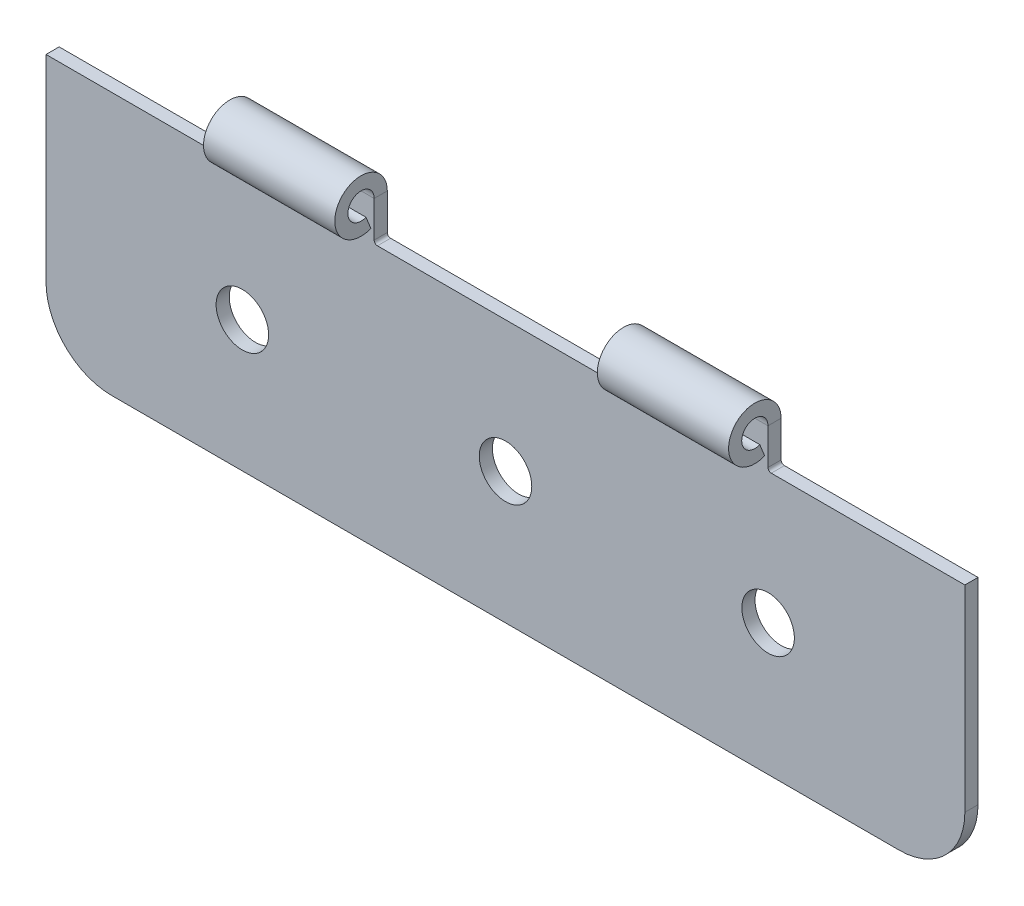
ISO-10303-21;
HEADER;
FILE_DESCRIPTION(('STEP AP214'),'2;1');
FILE_NAME('part.step','',(''),(''),'','','');
FILE_SCHEMA(('AUTOMOTIVE_DESIGN { 1 0 10303 214 1 1 1 1 }'));
ENDSEC;
DATA;
#1=APPLICATION_CONTEXT('core data for automotive mechanical design processes');
#2=APPLICATION_PROTOCOL_DEFINITION('international standard','automotive_design',2000,#1);
#3=PRODUCT_CONTEXT('',#1,'mechanical');
#4=PRODUCT('Part','Part','',(#3));
#5=PRODUCT_RELATED_PRODUCT_CATEGORY('part','',(#4));
#6=PRODUCT_DEFINITION_FORMATION('','',#4);
#7=PRODUCT_DEFINITION_CONTEXT('part definition',#1,'design');
#8=PRODUCT_DEFINITION('design','',#6,#7);
#9=PRODUCT_DEFINITION_SHAPE('','',#8);
#10=(LENGTH_UNIT() NAMED_UNIT(*) SI_UNIT(.MILLI.,.METRE.));
#11=(NAMED_UNIT(*) PLANE_ANGLE_UNIT() SI_UNIT($,.RADIAN.));
#12=(NAMED_UNIT(*) SI_UNIT($,.STERADIAN.) SOLID_ANGLE_UNIT());
#13=UNCERTAINTY_MEASURE_WITH_UNIT(LENGTH_MEASURE(1.E-05),#10,'distance_accuracy_value','');
#14=(GEOMETRIC_REPRESENTATION_CONTEXT(3) GLOBAL_UNCERTAINTY_ASSIGNED_CONTEXT((#13)) GLOBAL_UNIT_ASSIGNED_CONTEXT((#10,
#11,#12)) REPRESENTATION_CONTEXT('',''));
#15=CARTESIAN_POINT('',(0.,0.,0.));
#16=DIRECTION('',(0.,0.,1.));
#17=DIRECTION('',(1.,0.,0.));
#18=AXIS2_PLACEMENT_3D('',#15,#16,#17);
#19=CARTESIAN_POINT('',(45.,20.,-1.));
#20=DIRECTION('',(-1.,0.,0.));
#21=DIRECTION('',(0.,0.,1.));
#22=AXIS2_PLACEMENT_3D('',#19,#20,#21);
#23=PLANE('',#22);
#24=DIRECTION('',(0.,-1.,0.));
#25=VECTOR('',#24,1.);
#26=CARTESIAN_POINT('',(45.,20.,-1.));
#27=LINE('',#26,#25);
#28=CARTESIAN_POINT('',(45.,23.,-1.));
#29=VERTEX_POINT('',#28);
#30=CARTESIAN_POINT('',(45.,20.25,-1.));
#31=VERTEX_POINT('',#30);
#32=EDGE_CURVE('E198',#29,#31,#27,.T.);
#33=ORIENTED_EDGE('',*,*,#32,.T.);
#34=DIRECTION('',(0.,0.,1.));
#35=VECTOR('',#34,1.);
#36=CARTESIAN_POINT('',(45.,20.25,0.));
#37=LINE('',#36,#35);
#38=CARTESIAN_POINT('',(45.,20.25,0.));
#39=VERTEX_POINT('',#38);
#40=EDGE_CURVE('E356',#31,#39,#37,.T.);
#41=ORIENTED_EDGE('',*,*,#40,.T.);
#42=DIRECTION('',(0.,-1.,0.));
#43=VECTOR('',#42,1.);
#44=CARTESIAN_POINT('',(45.,20.,0.));
#45=LINE('',#44,#43);
#46=CARTESIAN_POINT('',(45.,23.,0.));
#47=VERTEX_POINT('',#46);
#48=EDGE_CURVE('E314',#47,#39,#45,.T.);
#49=ORIENTED_EDGE('',*,*,#48,.F.);
#50=DIRECTION('',(0.,0.,-1.));
#51=VECTOR('',#50,1.);
#52=CARTESIAN_POINT('',(45.,23.,0.));
#53=LINE('',#52,#51);
#54=EDGE_CURVE('E210',#47,#29,#53,.T.);
#55=ORIENTED_EDGE('',*,*,#54,.T.);
#56=EDGE_LOOP('',(#33,#41,#49,#55));
#57=FACE_BOUND('',#56,.T.);
#58=ADVANCED_FACE('F41',(#57),#23,.T.);
#59=CARTESIAN_POINT('',(15.,20.,-1.));
#60=DIRECTION('',(-1.,0.,0.));
#61=DIRECTION('',(0.,0.,1.));
#62=AXIS2_PLACEMENT_3D('',#59,#60,#61);
#63=PLANE('',#62);
#64=DIRECTION('',(0.,-1.,0.));
#65=VECTOR('',#64,1.);
#66=CARTESIAN_POINT('',(15.,20.,-1.));
#67=LINE('',#66,#65);
#68=CARTESIAN_POINT('',(15.,23.,-1.));
#69=VERTEX_POINT('',#68);
#70=CARTESIAN_POINT('',(15.,20.25,-1.));
#71=VERTEX_POINT('',#70);
#72=EDGE_CURVE('E296',#69,#71,#67,.T.);
#73=ORIENTED_EDGE('',*,*,#72,.T.);
#74=DIRECTION('',(0.,0.,1.));
#75=VECTOR('',#74,1.);
#76=CARTESIAN_POINT('',(15.,20.25,0.));
#77=LINE('',#76,#75);
#78=CARTESIAN_POINT('',(15.,20.25,0.));
#79=VERTEX_POINT('',#78);
#80=EDGE_CURVE('E351',#71,#79,#77,.T.);
#81=ORIENTED_EDGE('',*,*,#80,.T.);
#82=DIRECTION('',(0.,-1.,0.));
#83=VECTOR('',#82,1.);
#84=CARTESIAN_POINT('',(15.,20.,0.));
#85=LINE('',#84,#83);
#86=CARTESIAN_POINT('',(15.,23.,0.));
#87=VERTEX_POINT('',#86);
#88=EDGE_CURVE('E321',#87,#79,#85,.T.);
#89=ORIENTED_EDGE('',*,*,#88,.F.);
#90=DIRECTION('',(0.,0.,-1.));
#91=VECTOR('',#90,1.);
#92=CARTESIAN_POINT('',(15.,23.,0.));
#93=LINE('',#92,#91);
#94=EDGE_CURVE('E256',#87,#69,#93,.T.);
#95=ORIENTED_EDGE('',*,*,#94,.T.);
#96=EDGE_LOOP('',(#73,#81,#89,#95));
#97=FACE_BOUND('',#96,.T.);
#98=ADVANCED_FACE('F422',(#97),#63,.T.);
#99=CARTESIAN_POINT('',(70.,0.,-1.));
#100=DIRECTION('',(0.,-1.,0.));
#101=DIRECTION('',(1.,0.,0.));
#102=AXIS2_PLACEMENT_3D('',#99,#100,#101);
#103=PLANE('',#102);
#104=DIRECTION('',(1.,0.,0.));
#105=VECTOR('',#104,1.);
#106=CARTESIAN_POINT('',(70.,0.,0.));
#107=LINE('',#106,#105);
#108=CARTESIAN_POINT('',(5.,0.,0.));
#109=VERTEX_POINT('',#108);
#110=CARTESIAN_POINT('',(65.,0.,0.));
#111=VERTEX_POINT('',#110);
#112=EDGE_CURVE('E279',#109,#111,#107,.T.);
#113=ORIENTED_EDGE('',*,*,#112,.F.);
#114=DIRECTION('',(0.,0.,1.));
#115=VECTOR('',#114,1.);
#116=CARTESIAN_POINT('',(5.,0.,-1.));
#117=LINE('',#116,#115);
#118=CARTESIAN_POINT('',(5.,0.,-1.));
#119=VERTEX_POINT('',#118);
#120=EDGE_CURVE('E343',#109,#119,#117,.F.);
#121=ORIENTED_EDGE('',*,*,#120,.T.);
#122=DIRECTION('',(1.,0.,0.));
#123=VECTOR('',#122,1.);
#124=CARTESIAN_POINT('',(70.,0.,-1.));
#125=LINE('',#124,#123);
#126=CARTESIAN_POINT('',(65.,0.,-1.));
#127=VERTEX_POINT('',#126);
#128=EDGE_CURVE('E282',#119,#127,#125,.T.);
#129=ORIENTED_EDGE('',*,*,#128,.T.);
#130=DIRECTION('',(0.,0.,1.));
#131=VECTOR('',#130,1.);
#132=CARTESIAN_POINT('',(65.,0.,-1.));
#133=LINE('',#132,#131);
#134=EDGE_CURVE('E340',#127,#111,#133,.T.);
#135=ORIENTED_EDGE('',*,*,#134,.T.);
#136=EDGE_LOOP('',(#113,#121,#129,#135));
#137=FACE_BOUND('',#136,.T.);
#138=ADVANCED_FACE('F401',(#137),#103,.T.);
#139=CARTESIAN_POINT('',(0.,0.,-1.));
#140=DIRECTION('',(-1.,0.,0.));
#141=DIRECTION('',(0.,0.,1.));
#142=AXIS2_PLACEMENT_3D('',#139,#140,#141);
#143=PLANE('',#142);
#144=DIRECTION('',(0.,-1.,0.));
#145=VECTOR('',#144,1.);
#146=CARTESIAN_POINT('',(0.,0.,-1.));
#147=LINE('',#146,#145);
#148=CARTESIAN_POINT('',(0.,20.,-1.));
#149=VERTEX_POINT('',#148);
#150=CARTESIAN_POINT('',(0.,5.,-1.));
#151=VERTEX_POINT('',#150);
#152=EDGE_CURVE('E301',#149,#151,#147,.T.);
#153=ORIENTED_EDGE('',*,*,#152,.T.);
#154=DIRECTION('',(0.,0.,1.));
#155=VECTOR('',#154,1.);
#156=CARTESIAN_POINT('',(0.,5.,-1.));
#157=LINE('',#156,#155);
#158=CARTESIAN_POINT('',(0.,5.,0.));
#159=VERTEX_POINT('',#158);
#160=EDGE_CURVE('E331',#151,#159,#157,.T.);
#161=ORIENTED_EDGE('',*,*,#160,.T.);
#162=DIRECTION('',(0.,-1.,0.));
#163=VECTOR('',#162,1.);
#164=CARTESIAN_POINT('',(0.,0.,0.));
#165=LINE('',#164,#163);
#166=CARTESIAN_POINT('',(0.,20.,0.));
#167=VERTEX_POINT('',#166);
#168=EDGE_CURVE('E286',#167,#159,#165,.T.);
#169=ORIENTED_EDGE('',*,*,#168,.F.);
#170=DIRECTION('',(0.,0.,1.));
#171=VECTOR('',#170,1.);
#172=CARTESIAN_POINT('',(0.,20.,-1.));
#173=LINE('',#172,#171);
#174=EDGE_CURVE('E328',#149,#167,#173,.T.);
#175=ORIENTED_EDGE('',*,*,#174,.F.);
#176=EDGE_LOOP('',(#153,#161,#169,#175));
#177=FACE_BOUND('',#176,.T.);
#178=ADVANCED_FACE('F409',(#177),#143,.T.);
#179=CARTESIAN_POINT('',(0.,20.,-1.));
#180=DIRECTION('',(0.,1.,0.));
#181=DIRECTION('',(0.,0.,1.));
#182=AXIS2_PLACEMENT_3D('',#179,#180,#181);
#183=PLANE('',#182);
#184=DIRECTION('',(-1.,0.,0.));
#185=VECTOR('',#184,1.);
#186=CARTESIAN_POINT('',(0.,20.,0.));
#187=LINE('',#186,#185);
#188=CARTESIAN_POINT('',(14.75,20.,0.));
#189=VERTEX_POINT('',#188);
#190=EDGE_CURVE('E324',#189,#167,#187,.T.);
#191=ORIENTED_EDGE('',*,*,#190,.F.);
#192=DIRECTION('',(0.,0.,1.));
#193=VECTOR('',#192,1.);
#194=CARTESIAN_POINT('',(14.75,20.,-1.));
#195=LINE('',#194,#193);
#196=CARTESIAN_POINT('',(14.75,20.,-1.));
#197=VERTEX_POINT('',#196);
#198=EDGE_CURVE('E354',#189,#197,#195,.F.);
#199=ORIENTED_EDGE('',*,*,#198,.T.);
#200=DIRECTION('',(-1.,0.,0.));
#201=VECTOR('',#200,1.);
#202=CARTESIAN_POINT('',(0.,20.,-1.));
#203=LINE('',#202,#201);
#204=EDGE_CURVE('E299',#197,#149,#203,.T.);
#205=ORIENTED_EDGE('',*,*,#204,.T.);
#206=ORIENTED_EDGE('',*,*,#174,.T.);
#207=EDGE_LOOP('',(#191,#199,#205,#206));
#208=FACE_BOUND('',#207,.T.);
#209=ADVANCED_FACE('F576',(#208),#183,.T.);
#210=CARTESIAN_POINT('',(25.,25.,-1.));
#211=DIRECTION('',(1.,0.,0.));
#212=DIRECTION('',(0.,0.,-1.));
#213=AXIS2_PLACEMENT_3D('',#210,#211,#212);
#214=PLANE('',#213);
#215=DIRECTION('',(0.,1.,0.));
#216=VECTOR('',#215,1.);
#217=CARTESIAN_POINT('',(25.,25.,0.));
#218=LINE('',#217,#216);
#219=CARTESIAN_POINT('',(25.,20.25,0.));
#220=VERTEX_POINT('',#219);
#221=CARTESIAN_POINT('',(25.,23.,0.));
#222=VERTEX_POINT('',#221);
#223=EDGE_CURVE('E319',#220,#222,#218,.T.);
#224=ORIENTED_EDGE('',*,*,#223,.F.);
#225=DIRECTION('',(0.,0.,1.));
#226=VECTOR('',#225,1.);
#227=CARTESIAN_POINT('',(25.,20.25,-1.));
#228=LINE('',#227,#226);
#229=CARTESIAN_POINT('',(25.,20.25,-1.));
#230=VERTEX_POINT('',#229);
#231=EDGE_CURVE('E56',#220,#230,#228,.F.);
#232=ORIENTED_EDGE('',*,*,#231,.T.);
#233=DIRECTION('',(0.,1.,0.));
#234=VECTOR('',#233,1.);
#235=CARTESIAN_POINT('',(25.,25.,-1.));
#236=LINE('',#235,#234);
#237=CARTESIAN_POINT('',(25.,23.,-1.));
#238=VERTEX_POINT('',#237);
#239=EDGE_CURVE('E294',#230,#238,#236,.T.);
#240=ORIENTED_EDGE('',*,*,#239,.T.);
#241=DIRECTION('',(0.,0.,-1.));
#242=VECTOR('',#241,1.);
#243=CARTESIAN_POINT('',(25.,23.,0.));
#244=LINE('',#243,#242);
#245=EDGE_CURVE('E272',#222,#238,#244,.T.);
#246=ORIENTED_EDGE('',*,*,#245,.F.);
#247=EDGE_LOOP('',(#224,#232,#240,#246));
#248=FACE_BOUND('',#247,.T.);
#249=ADVANCED_FACE('F435',(#248),#214,.T.);
#250=CARTESIAN_POINT('',(25.,20.,-1.));
#251=DIRECTION('',(0.,1.,0.));
#252=DIRECTION('',(0.,0.,1.));
#253=AXIS2_PLACEMENT_3D('',#250,#251,#252);
#254=PLANE('',#253);
#255=DIRECTION('',(-1.,0.,0.));
#256=VECTOR('',#255,1.);
#257=CARTESIAN_POINT('',(25.,20.,0.));
#258=LINE('',#257,#256);
#259=CARTESIAN_POINT('',(44.75,20.,0.));
#260=VERTEX_POINT('',#259);
#261=CARTESIAN_POINT('',(25.25,20.,0.));
#262=VERTEX_POINT('',#261);
#263=EDGE_CURVE('E317',#260,#262,#258,.T.);
#264=ORIENTED_EDGE('',*,*,#263,.F.);
#265=DIRECTION('',(0.,0.,1.));
#266=VECTOR('',#265,1.);
#267=CARTESIAN_POINT('',(44.75,20.,-1.));
#268=LINE('',#267,#266);
#269=CARTESIAN_POINT('',(44.75,20.,-1.));
#270=VERTEX_POINT('',#269);
#271=EDGE_CURVE('E362',#260,#270,#268,.F.);
#272=ORIENTED_EDGE('',*,*,#271,.T.);
#273=DIRECTION('',(-1.,0.,0.));
#274=VECTOR('',#273,1.);
#275=CARTESIAN_POINT('',(25.,20.,-1.));
#276=LINE('',#275,#274);
#277=CARTESIAN_POINT('',(25.25,20.,-1.));
#278=VERTEX_POINT('',#277);
#279=EDGE_CURVE('E291',#270,#278,#276,.T.);
#280=ORIENTED_EDGE('',*,*,#279,.T.);
#281=DIRECTION('',(0.,0.,1.));
#282=VECTOR('',#281,1.);
#283=CARTESIAN_POINT('',(25.25,20.,0.));
#284=LINE('',#283,#282);
#285=EDGE_CURVE('E359',#278,#262,#284,.T.);
#286=ORIENTED_EDGE('',*,*,#285,.T.);
#287=EDGE_LOOP('',(#264,#272,#280,#286));
#288=FACE_BOUND('',#287,.T.);
#289=ADVANCED_FACE('F442',(#288),#254,.T.);
#290=CARTESIAN_POINT('',(55.,25.,-1.));
#291=DIRECTION('',(1.,0.,0.));
#292=DIRECTION('',(0.,0.,-1.));
#293=AXIS2_PLACEMENT_3D('',#290,#291,#292);
#294=PLANE('',#293);
#295=DIRECTION('',(0.,1.,0.));
#296=VECTOR('',#295,1.);
#297=CARTESIAN_POINT('',(55.,25.,0.));
#298=LINE('',#297,#296);
#299=CARTESIAN_POINT('',(55.,20.25,0.));
#300=VERTEX_POINT('',#299);
#301=CARTESIAN_POINT('',(55.,23.,0.));
#302=VERTEX_POINT('',#301);
#303=EDGE_CURVE('E312',#300,#302,#298,.T.);
#304=ORIENTED_EDGE('',*,*,#303,.F.);
#305=DIRECTION('',(0.,0.,1.));
#306=VECTOR('',#305,1.);
#307=CARTESIAN_POINT('',(55.,20.25,-1.));
#308=LINE('',#307,#306);
#309=CARTESIAN_POINT('',(55.,20.25,-1.));
#310=VERTEX_POINT('',#309);
#311=EDGE_CURVE('E194',#300,#310,#308,.F.);
#312=ORIENTED_EDGE('',*,*,#311,.T.);
#313=DIRECTION('',(0.,1.,0.));
#314=VECTOR('',#313,1.);
#315=CARTESIAN_POINT('',(55.,25.,-1.));
#316=LINE('',#315,#314);
#317=CARTESIAN_POINT('',(55.,23.,-1.));
#318=VERTEX_POINT('',#317);
#319=EDGE_CURVE('E188',#310,#318,#316,.T.);
#320=ORIENTED_EDGE('',*,*,#319,.T.);
#321=DIRECTION('',(0.,0.,-1.));
#322=VECTOR('',#321,1.);
#323=CARTESIAN_POINT('',(55.,23.,0.));
#324=LINE('',#323,#322);
#325=EDGE_CURVE('E192',#302,#318,#324,.T.);
#326=ORIENTED_EDGE('',*,*,#325,.F.);
#327=EDGE_LOOP('',(#304,#312,#320,#326));
#328=FACE_BOUND('',#327,.T.);
#329=ADVANCED_FACE('F191',(#328),#294,.T.);
#330=CARTESIAN_POINT('',(55.,20.,-1.));
#331=DIRECTION('',(0.,1.,0.));
#332=DIRECTION('',(0.,0.,1.));
#333=AXIS2_PLACEMENT_3D('',#330,#331,#332);
#334=PLANE('',#333);
#335=DIRECTION('',(-1.,0.,0.));
#336=VECTOR('',#335,1.);
#337=CARTESIAN_POINT('',(55.,20.,-1.));
#338=LINE('',#337,#336);
#339=CARTESIAN_POINT('',(70.,20.,-1.));
#340=VERTEX_POINT('',#339);
#341=CARTESIAN_POINT('',(55.25,20.,-1.));
#342=VERTEX_POINT('',#341);
#343=EDGE_CURVE('E199',#340,#342,#338,.T.);
#344=ORIENTED_EDGE('',*,*,#343,.T.);
#345=DIRECTION('',(0.,0.,1.));
#346=VECTOR('',#345,1.);
#347=CARTESIAN_POINT('',(55.25,20.,0.));
#348=LINE('',#347,#346);
#349=CARTESIAN_POINT('',(55.25,20.,0.));
#350=VERTEX_POINT('',#349);
#351=EDGE_CURVE('E364',#342,#350,#348,.T.);
#352=ORIENTED_EDGE('',*,*,#351,.T.);
#353=DIRECTION('',(-1.,0.,0.));
#354=VECTOR('',#353,1.);
#355=CARTESIAN_POINT('',(55.,20.,0.));
#356=LINE('',#355,#354);
#357=CARTESIAN_POINT('',(70.,20.,0.));
#358=VERTEX_POINT('',#357);
#359=EDGE_CURVE('E309',#358,#350,#356,.T.);
#360=ORIENTED_EDGE('',*,*,#359,.F.);
#361=DIRECTION('',(0.,0.,1.));
#362=VECTOR('',#361,1.);
#363=CARTESIAN_POINT('',(70.,20.,-1.));
#364=LINE('',#363,#362);
#365=EDGE_CURVE('E304',#340,#358,#364,.T.);
#366=ORIENTED_EDGE('',*,*,#365,.F.);
#367=EDGE_LOOP('',(#344,#352,#360,#366));
#368=FACE_BOUND('',#367,.T.);
#369=ADVANCED_FACE('F386',(#368),#334,.T.);
#370=CARTESIAN_POINT('',(70.,20.,-1.));
#371=DIRECTION('',(1.,0.,0.));
#372=DIRECTION('',(0.,0.,-1.));
#373=AXIS2_PLACEMENT_3D('',#370,#371,#372);
#374=PLANE('',#373);
#375=DIRECTION('',(0.,1.,0.));
#376=VECTOR('',#375,1.);
#377=CARTESIAN_POINT('',(70.,20.,0.));
#378=LINE('',#377,#376);
#379=CARTESIAN_POINT('',(70.,5.,0.));
#380=VERTEX_POINT('',#379);
#381=EDGE_CURVE('E307',#380,#358,#378,.T.);
#382=ORIENTED_EDGE('',*,*,#381,.F.);
#383=DIRECTION('',(0.,0.,1.));
#384=VECTOR('',#383,1.);
#385=CARTESIAN_POINT('',(70.,5.,-1.));
#386=LINE('',#385,#384);
#387=CARTESIAN_POINT('',(70.,5.,-1.));
#388=VERTEX_POINT('',#387);
#389=EDGE_CURVE('E349',#380,#388,#386,.F.);
#390=ORIENTED_EDGE('',*,*,#389,.T.);
#391=DIRECTION('',(0.,1.,0.));
#392=VECTOR('',#391,1.);
#393=CARTESIAN_POINT('',(70.,20.,-1.));
#394=LINE('',#393,#392);
#395=EDGE_CURVE('E285',#388,#340,#394,.T.);
#396=ORIENTED_EDGE('',*,*,#395,.T.);
#397=ORIENTED_EDGE('',*,*,#365,.T.);
#398=EDGE_LOOP('',(#382,#390,#396,#397));
#399=FACE_BOUND('',#398,.T.);
#400=ADVANCED_FACE('F394',(#399),#374,.T.);
#401=CARTESIAN_POINT('',(0.,0.,-1.));
#402=DIRECTION('',(0.,0.,-1.));
#403=DIRECTION('',(-1.,0.,0.));
#404=AXIS2_PLACEMENT_3D('',#401,#402,#403);
#405=PLANE('',#404);
#406=CARTESIAN_POINT('',(55.0116838185663,10.0036765351825,-1.));
#407=DIRECTION('',(0.,0.,1.));
#408=DIRECTION('',(1.,0.,0.));
#409=AXIS2_PLACEMENT_3D('',#406,#407,#408);
#410=CIRCLE('',#409,2.);
#411=CARTESIAN_POINT('',(57.0116838185663,10.0036765351825,-1.));
#412=VERTEX_POINT('',#411);
#413=EDGE_CURVE('E781',#412,#412,#410,.T.);
#414=ORIENTED_EDGE('',*,*,#413,.T.);
#415=EDGE_LOOP('',(#414));
#416=FACE_BOUND('',#415,.T.);
#417=CARTESIAN_POINT('',(35.0056870293111,10.0021608828948,-1.));
#418=DIRECTION('',(0.,0.,1.));
#419=DIRECTION('',(1.,0.,0.));
#420=AXIS2_PLACEMENT_3D('',#417,#418,#419);
#421=CIRCLE('',#420,2.);
#422=CARTESIAN_POINT('',(37.0056870293111,10.0021608828948,-1.));
#423=VERTEX_POINT('',#422);
#424=EDGE_CURVE('E774',#423,#423,#421,.T.);
#425=ORIENTED_EDGE('',*,*,#424,.T.);
#426=EDGE_LOOP('',(#425));
#427=FACE_BOUND('',#426,.T.);
#428=CARTESIAN_POINT('',(14.959262118329,9.98085666020251,-1.));
#429=DIRECTION('',(0.,0.,1.));
#430=DIRECTION('',(1.,0.,0.));
#431=AXIS2_PLACEMENT_3D('',#428,#429,#430);
#432=CIRCLE('',#431,2.);
#433=CARTESIAN_POINT('',(16.959262118329,9.98085666020251,-1.));
#434=VERTEX_POINT('',#433);
#435=EDGE_CURVE('E241',#434,#434,#432,.T.);
#436=ORIENTED_EDGE('',*,*,#435,.T.);
#437=EDGE_LOOP('',(#436));
#438=FACE_BOUND('',#437,.T.);
#439=ORIENTED_EDGE('',*,*,#128,.F.);
#440=CARTESIAN_POINT('',(5.,5.,-1.));
#441=DIRECTION('',(0.,0.,-1.));
#442=DIRECTION('',(-1.,0.,0.));
#443=AXIS2_PLACEMENT_3D('',#440,#441,#442);
#444=CIRCLE('',#443,5.);
#445=EDGE_CURVE('E347',#119,#151,#444,.T.);
#446=ORIENTED_EDGE('',*,*,#445,.T.);
#447=ORIENTED_EDGE('',*,*,#152,.F.);
#448=ORIENTED_EDGE('',*,*,#204,.F.);
#449=CARTESIAN_POINT('',(14.75,20.25,-1.));
#450=DIRECTION('',(0.,0.,-1.));
#451=DIRECTION('',(-1.,0.,0.));
#452=AXIS2_PLACEMENT_3D('',#449,#450,#451);
#453=CIRCLE('',#452,0.25);
#454=EDGE_CURVE('E371',#197,#71,#453,.F.);
#455=ORIENTED_EDGE('',*,*,#454,.T.);
#456=ORIENTED_EDGE('',*,*,#72,.F.);
#457=DIRECTION('',(-1.,0.,0.));
#458=VECTOR('',#457,1.);
#459=CARTESIAN_POINT('',(15.,23.,-1.));
#460=LINE('',#459,#458);
#461=EDGE_CURVE('E249',#69,#238,#460,.F.);
#462=ORIENTED_EDGE('',*,*,#461,.T.);
#463=ORIENTED_EDGE('',*,*,#239,.F.);
#464=CARTESIAN_POINT('',(25.25,20.25,-1.));
#465=DIRECTION('',(0.,0.,-1.));
#466=DIRECTION('',(-1.,0.,0.));
#467=AXIS2_PLACEMENT_3D('',#464,#465,#466);
#468=CIRCLE('',#467,0.25);
#469=EDGE_CURVE('E11',#230,#278,#468,.F.);
#470=ORIENTED_EDGE('',*,*,#469,.T.);
#471=ORIENTED_EDGE('',*,*,#279,.F.);
#472=CARTESIAN_POINT('',(44.75,20.25,-1.));
#473=DIRECTION('',(0.,0.,-1.));
#474=DIRECTION('',(-1.,0.,0.));
#475=AXIS2_PLACEMENT_3D('',#472,#473,#474);
#476=CIRCLE('',#475,0.25);
#477=EDGE_CURVE('E375',#270,#31,#476,.F.);
#478=ORIENTED_EDGE('',*,*,#477,.T.);
#479=ORIENTED_EDGE('',*,*,#32,.F.);
#480=DIRECTION('',(-1.,0.,0.));
#481=VECTOR('',#480,1.);
#482=CARTESIAN_POINT('',(45.,23.,-1.));
#483=LINE('',#482,#481);
#484=EDGE_CURVE('E216',#29,#318,#483,.F.);
#485=ORIENTED_EDGE('',*,*,#484,.T.);
#486=ORIENTED_EDGE('',*,*,#319,.F.);
#487=CARTESIAN_POINT('',(55.25,20.25,-1.));
#488=DIRECTION('',(0.,0.,-1.));
#489=DIRECTION('',(-1.,0.,0.));
#490=AXIS2_PLACEMENT_3D('',#487,#488,#489);
#491=CIRCLE('',#490,0.25);
#492=EDGE_CURVE('E379',#310,#342,#491,.F.);
#493=ORIENTED_EDGE('',*,*,#492,.T.);
#494=ORIENTED_EDGE('',*,*,#343,.F.);
#495=ORIENTED_EDGE('',*,*,#395,.F.);
#496=CARTESIAN_POINT('',(65.,5.,-1.));
#497=DIRECTION('',(0.,0.,-1.));
#498=DIRECTION('',(-1.,0.,0.));
#499=AXIS2_PLACEMENT_3D('',#496,#497,#498);
#500=CIRCLE('',#499,5.);
#501=EDGE_CURVE('E345',#388,#127,#500,.T.);
#502=ORIENTED_EDGE('',*,*,#501,.T.);
#503=EDGE_LOOP('',(#439,#446,#447,#448,#455,#456,#462,#463,#470,#471,#478,#479,#485,#486,#493,
#494,#495,#502));
#504=FACE_BOUND('',#503,.T.);
#505=ADVANCED_FACE('F223',(#416,#427,#438,#504),#405,.T.);
#506=CARTESIAN_POINT('',(0.,0.,0.));
#507=DIRECTION('',(0.,0.,-1.));
#508=DIRECTION('',(-1.,0.,0.));
#509=AXIS2_PLACEMENT_3D('',#506,#507,#508);
#510=PLANE('',#509);
#511=CARTESIAN_POINT('',(55.0116838185663,10.0036765351825,0.));
#512=DIRECTION('',(0.,0.,1.));
#513=DIRECTION('',(1.,0.,0.));
#514=AXIS2_PLACEMENT_3D('',#511,#512,#513);
#515=CIRCLE('',#514,2.);
#516=CARTESIAN_POINT('',(57.0116838185663,10.0036765351825,0.));
#517=VERTEX_POINT('',#516);
#518=EDGE_CURVE('E784',#517,#517,#515,.T.);
#519=ORIENTED_EDGE('',*,*,#518,.F.);
#520=EDGE_LOOP('',(#519));
#521=FACE_BOUND('',#520,.T.);
#522=CARTESIAN_POINT('',(35.0056870293111,10.0021608828948,0.));
#523=DIRECTION('',(0.,0.,1.));
#524=DIRECTION('',(1.,0.,0.));
#525=AXIS2_PLACEMENT_3D('',#522,#523,#524);
#526=CIRCLE('',#525,2.);
#527=CARTESIAN_POINT('',(37.0056870293111,10.0021608828948,0.));
#528=VERTEX_POINT('',#527);
#529=EDGE_CURVE('E776',#528,#528,#526,.T.);
#530=ORIENTED_EDGE('',*,*,#529,.F.);
#531=EDGE_LOOP('',(#530));
#532=FACE_BOUND('',#531,.T.);
#533=CARTESIAN_POINT('',(14.959262118329,9.98085666020251,0.));
#534=DIRECTION('',(0.,0.,1.));
#535=DIRECTION('',(1.,0.,0.));
#536=AXIS2_PLACEMENT_3D('',#533,#534,#535);
#537=CIRCLE('',#536,2.);
#538=CARTESIAN_POINT('',(16.959262118329,9.98085666020251,0.));
#539=VERTEX_POINT('',#538);
#540=EDGE_CURVE('E229',#539,#539,#537,.T.);
#541=ORIENTED_EDGE('',*,*,#540,.F.);
#542=EDGE_LOOP('',(#541));
#543=FACE_BOUND('',#542,.T.);
#544=ORIENTED_EDGE('',*,*,#168,.T.);
#545=CARTESIAN_POINT('',(5.,5.,0.));
#546=DIRECTION('',(0.,0.,-1.));
#547=DIRECTION('',(-1.,0.,0.));
#548=AXIS2_PLACEMENT_3D('',#545,#546,#547);
#549=CIRCLE('',#548,5.);
#550=EDGE_CURVE('E338',#159,#109,#549,.F.);
#551=ORIENTED_EDGE('',*,*,#550,.T.);
#552=ORIENTED_EDGE('',*,*,#112,.T.);
#553=CARTESIAN_POINT('',(65.,5.,0.));
#554=DIRECTION('',(0.,0.,-1.));
#555=DIRECTION('',(-1.,0.,0.));
#556=AXIS2_PLACEMENT_3D('',#553,#554,#555);
#557=CIRCLE('',#556,5.);
#558=EDGE_CURVE('E336',#111,#380,#557,.F.);
#559=ORIENTED_EDGE('',*,*,#558,.T.);
#560=ORIENTED_EDGE('',*,*,#381,.T.);
#561=ORIENTED_EDGE('',*,*,#359,.T.);
#562=CARTESIAN_POINT('',(55.25,20.25,0.));
#563=DIRECTION('',(0.,0.,-1.));
#564=DIRECTION('',(-1.,0.,0.));
#565=AXIS2_PLACEMENT_3D('',#562,#563,#564);
#566=CIRCLE('',#565,0.25);
#567=EDGE_CURVE('E377',#350,#300,#566,.T.);
#568=ORIENTED_EDGE('',*,*,#567,.T.);
#569=ORIENTED_EDGE('',*,*,#303,.T.);
#570=DIRECTION('',(-1.,0.,0.));
#571=VECTOR('',#570,1.);
#572=CARTESIAN_POINT('',(45.,23.,0.));
#573=LINE('',#572,#571);
#574=EDGE_CURVE('E234',#47,#302,#573,.F.);
#575=ORIENTED_EDGE('',*,*,#574,.F.);
#576=ORIENTED_EDGE('',*,*,#48,.T.);
#577=CARTESIAN_POINT('',(44.75,20.25,0.));
#578=DIRECTION('',(0.,0.,-1.));
#579=DIRECTION('',(-1.,0.,0.));
#580=AXIS2_PLACEMENT_3D('',#577,#578,#579);
#581=CIRCLE('',#580,0.25);
#582=EDGE_CURVE('E373',#39,#260,#581,.T.);
#583=ORIENTED_EDGE('',*,*,#582,.T.);
#584=ORIENTED_EDGE('',*,*,#263,.T.);
#585=CARTESIAN_POINT('',(25.25,20.25,0.));
#586=DIRECTION('',(0.,0.,-1.));
#587=DIRECTION('',(-1.,0.,0.));
#588=AXIS2_PLACEMENT_3D('',#585,#586,#587);
#589=CIRCLE('',#588,0.25);
#590=EDGE_CURVE('E49',#262,#220,#589,.T.);
#591=ORIENTED_EDGE('',*,*,#590,.T.);
#592=ORIENTED_EDGE('',*,*,#223,.T.);
#593=DIRECTION('',(-1.,0.,0.));
#594=VECTOR('',#593,1.);
#595=CARTESIAN_POINT('',(15.,23.,0.));
#596=LINE('',#595,#594);
#597=EDGE_CURVE('E265',#87,#222,#596,.F.);
#598=ORIENTED_EDGE('',*,*,#597,.F.);
#599=ORIENTED_EDGE('',*,*,#88,.T.);
#600=CARTESIAN_POINT('',(14.75,20.25,0.));
#601=DIRECTION('',(0.,0.,-1.));
#602=DIRECTION('',(-1.,0.,0.));
#603=AXIS2_PLACEMENT_3D('',#600,#601,#602);
#604=CIRCLE('',#603,0.25);
#605=EDGE_CURVE('E369',#79,#189,#604,.T.);
#606=ORIENTED_EDGE('',*,*,#605,.T.);
#607=ORIENTED_EDGE('',*,*,#190,.T.);
#608=EDGE_LOOP('',(#544,#551,#552,#559,#560,#561,#568,#569,#575,#576,#583,#584,#591,#592,#598,
#599,#606,#607));
#609=FACE_BOUND('',#608,.T.);
#610=ADVANCED_FACE('F389',(#521,#532,#543,#609),#510,.F.);
#611=CARTESIAN_POINT('',(20.,22.0728161454332,0.62539340658408));
#612=DIRECTION('',(0.,-0.374606593415919,0.927183854566785));
#613=DIRECTION('',(-1.,0.,0.));
#614=AXIS2_PLACEMENT_3D('',#611,#612,#613);
#615=PLANE('',#614);
#616=DIRECTION('',(0.,-0.927183854566785,-0.374606593415919));
#617=VECTOR('',#616,1.);
#618=CARTESIAN_POINT('',(15.,22.0728161454332,0.62539340658408));
#619=LINE('',#618,#617);
#620=CARTESIAN_POINT('',(15.,22.0728161454332,0.62539340658408));
#621=VERTEX_POINT('',#620);
#622=CARTESIAN_POINT('',(15.,21.1456322908664,0.250786813168161));
#623=VERTEX_POINT('',#622);
#624=EDGE_CURVE('E277',#621,#623,#619,.T.);
#625=ORIENTED_EDGE('',*,*,#624,.F.);
#626=DIRECTION('',(-1.,0.,0.));
#627=VECTOR('',#626,1.);
#628=CARTESIAN_POINT('',(15.,22.0728161454332,0.62539340658408));
#629=LINE('',#628,#627);
#630=CARTESIAN_POINT('',(25.,22.0728161454332,0.62539340658408));
#631=VERTEX_POINT('',#630);
#632=EDGE_CURVE('E246',#631,#621,#629,.T.);
#633=ORIENTED_EDGE('',*,*,#632,.F.);
#634=DIRECTION('',(0.,-0.927183854566785,-0.374606593415919));
#635=VECTOR('',#634,1.);
#636=CARTESIAN_POINT('',(25.,22.0728161454332,0.62539340658408));
#637=LINE('',#636,#635);
#638=CARTESIAN_POINT('',(25.,21.1456322908664,0.250786813168161));
#639=VERTEX_POINT('',#638);
#640=EDGE_CURVE('E275',#631,#639,#637,.T.);
#641=ORIENTED_EDGE('',*,*,#640,.T.);
#642=DIRECTION('',(-1.,0.,0.));
#643=VECTOR('',#642,1.);
#644=CARTESIAN_POINT('',(15.,21.1456322908664,0.250786813168161));
#645=LINE('',#644,#643);
#646=EDGE_CURVE('E257',#639,#623,#645,.T.);
#647=ORIENTED_EDGE('',*,*,#646,.T.);
#648=EDGE_LOOP('',(#625,#633,#641,#647));
#649=FACE_BOUND('',#648,.T.);
#650=ADVANCED_FACE('F530',(#649),#615,.F.);
#651=CARTESIAN_POINT('',(25.,23.,1.));
#652=DIRECTION('',(1.,0.,0.));
#653=DIRECTION('',(0.,0.,-1.));
#654=AXIS2_PLACEMENT_3D('',#651,#652,#653);
#655=PLANE('',#654);
#656=ORIENTED_EDGE('',*,*,#640,.F.);
#657=CARTESIAN_POINT('',(25.,23.,1.));
#658=DIRECTION('',(-1.,0.,0.));
#659=DIRECTION('',(0.,0.,1.));
#660=AXIS2_PLACEMENT_3D('',#657,#658,#659);
#661=CIRCLE('',#660,1.);
#662=EDGE_CURVE('E260',#222,#631,#661,.F.);
#663=ORIENTED_EDGE('',*,*,#662,.F.);
#664=ORIENTED_EDGE('',*,*,#245,.T.);
#665=CARTESIAN_POINT('',(25.,23.,1.));
#666=DIRECTION('',(-1.,0.,0.));
#667=DIRECTION('',(0.,0.,1.));
#668=AXIS2_PLACEMENT_3D('',#665,#666,#667);
#669=CIRCLE('',#668,2.);
#670=EDGE_CURVE('E252',#238,#639,#669,.F.);
#671=ORIENTED_EDGE('',*,*,#670,.T.);
#672=EDGE_LOOP('',(#656,#663,#664,#671));
#673=FACE_BOUND('',#672,.T.);
#674=ADVANCED_FACE('F432',(#673),#655,.T.);
#675=CARTESIAN_POINT('',(15.,23.,1.));
#676=DIRECTION('',(1.,0.,0.));
#677=DIRECTION('',(0.,0.,-1.));
#678=AXIS2_PLACEMENT_3D('',#675,#676,#677);
#679=PLANE('',#678);
#680=CARTESIAN_POINT('',(15.,23.,1.));
#681=DIRECTION('',(-1.,0.,0.));
#682=DIRECTION('',(0.,0.,1.));
#683=AXIS2_PLACEMENT_3D('',#680,#681,#682);
#684=CIRCLE('',#683,1.);
#685=EDGE_CURVE('E268',#621,#87,#684,.T.);
#686=ORIENTED_EDGE('',*,*,#685,.F.);
#687=ORIENTED_EDGE('',*,*,#624,.T.);
#688=CARTESIAN_POINT('',(15.,23.,1.));
#689=DIRECTION('',(-1.,0.,0.));
#690=DIRECTION('',(0.,0.,1.));
#691=AXIS2_PLACEMENT_3D('',#688,#689,#690);
#692=CIRCLE('',#691,2.);
#693=EDGE_CURVE('E253',#623,#69,#692,.T.);
#694=ORIENTED_EDGE('',*,*,#693,.T.);
#695=ORIENTED_EDGE('',*,*,#94,.F.);
#696=EDGE_LOOP('',(#686,#687,#694,#695));
#697=FACE_BOUND('',#696,.T.);
#698=ADVANCED_FACE('F713',(#697),#679,.F.);
#699=CARTESIAN_POINT('',(15.,23.,1.));
#700=DIRECTION('',(-1.,0.,0.));
#701=DIRECTION('',(0.,-0.927183854566784,-0.374606593415919));
#702=AXIS2_PLACEMENT_3D('',#699,#700,#701);
#703=CYLINDRICAL_SURFACE('',#702,2.);
#704=ORIENTED_EDGE('',*,*,#461,.F.);
#705=ORIENTED_EDGE('',*,*,#693,.F.);
#706=ORIENTED_EDGE('',*,*,#646,.F.);
#707=ORIENTED_EDGE('',*,*,#670,.F.);
#708=EDGE_LOOP('',(#704,#705,#706,#707));
#709=FACE_BOUND('',#708,.T.);
#710=ADVANCED_FACE('F466',(#709),#703,.T.);
#711=CARTESIAN_POINT('',(15.,23.,1.));
#712=DIRECTION('',(-1.,0.,0.));
#713=DIRECTION('',(0.,-0.927183854566784,-0.374606593415919));
#714=AXIS2_PLACEMENT_3D('',#711,#712,#713);
#715=CYLINDRICAL_SURFACE('',#714,1.);
#716=ORIENTED_EDGE('',*,*,#597,.T.);
#717=ORIENTED_EDGE('',*,*,#662,.T.);
#718=ORIENTED_EDGE('',*,*,#632,.T.);
#719=ORIENTED_EDGE('',*,*,#685,.T.);
#720=EDGE_LOOP('',(#716,#717,#718,#719));
#721=FACE_BOUND('',#720,.T.);
#722=ADVANCED_FACE('F427',(#721),#715,.F.);
#723=CARTESIAN_POINT('',(50.,22.0728161454332,0.62539340658408));
#724=DIRECTION('',(0.,-0.374606593415919,0.927183854566784));
#725=DIRECTION('',(-1.,0.,0.));
#726=AXIS2_PLACEMENT_3D('',#723,#724,#725);
#727=PLANE('',#726);
#728=DIRECTION('',(0.,-0.927183854566784,-0.374606593415919));
#729=VECTOR('',#728,1.);
#730=CARTESIAN_POINT('',(45.,22.0728161454332,0.62539340658408));
#731=LINE('',#730,#729);
#732=CARTESIAN_POINT('',(45.,22.0728161454332,0.62539340658408));
#733=VERTEX_POINT('',#732);
#734=CARTESIAN_POINT('',(45.,21.1456322908664,0.250786813168161));
#735=VERTEX_POINT('',#734);
#736=EDGE_CURVE('E244',#733,#735,#731,.T.);
#737=ORIENTED_EDGE('',*,*,#736,.F.);
#738=DIRECTION('',(-1.,0.,0.));
#739=VECTOR('',#738,1.);
#740=CARTESIAN_POINT('',(45.,22.0728161454332,0.62539340658408));
#741=LINE('',#740,#739);
#742=CARTESIAN_POINT('',(55.,22.0728161454332,0.62539340658408));
#743=VERTEX_POINT('',#742);
#744=EDGE_CURVE('E239',#743,#733,#741,.T.);
#745=ORIENTED_EDGE('',*,*,#744,.F.);
#746=DIRECTION('',(0.,-0.927183854566784,-0.374606593415919));
#747=VECTOR('',#746,1.);
#748=CARTESIAN_POINT('',(55.,22.0728161454332,0.62539340658408));
#749=LINE('',#748,#747);
#750=CARTESIAN_POINT('',(55.,21.1456322908664,0.250786813168161));
#751=VERTEX_POINT('',#750);
#752=EDGE_CURVE('E209',#743,#751,#749,.T.);
#753=ORIENTED_EDGE('',*,*,#752,.T.);
#754=DIRECTION('',(-1.,0.,0.));
#755=VECTOR('',#754,1.);
#756=CARTESIAN_POINT('',(45.,21.1456322908664,0.250786813168161));
#757=LINE('',#756,#755);
#758=EDGE_CURVE('E219',#751,#735,#757,.T.);
#759=ORIENTED_EDGE('',*,*,#758,.T.);
#760=EDGE_LOOP('',(#737,#745,#753,#759));
#761=FACE_BOUND('',#760,.T.);
#762=ADVANCED_FACE('F458',(#761),#727,.F.);
#763=CARTESIAN_POINT('',(55.,23.,0.999999999999999));
#764=DIRECTION('',(1.,0.,0.));
#765=DIRECTION('',(0.,0.,-1.));
#766=AXIS2_PLACEMENT_3D('',#763,#764,#765);
#767=PLANE('',#766);
#768=ORIENTED_EDGE('',*,*,#752,.F.);
#769=CARTESIAN_POINT('',(55.,23.,0.999999999999999));
#770=DIRECTION('',(-1.,0.,0.));
#771=DIRECTION('',(0.,0.,1.));
#772=AXIS2_PLACEMENT_3D('',#769,#770,#771);
#773=CIRCLE('',#772,0.999999999999999);
#774=EDGE_CURVE('E208',#302,#743,#773,.F.);
#775=ORIENTED_EDGE('',*,*,#774,.F.);
#776=ORIENTED_EDGE('',*,*,#325,.T.);
#777=CARTESIAN_POINT('',(55.,23.,0.999999999999999));
#778=DIRECTION('',(-1.,0.,0.));
#779=DIRECTION('',(0.,0.,1.));
#780=AXIS2_PLACEMENT_3D('',#777,#778,#779);
#781=CIRCLE('',#780,2.);
#782=EDGE_CURVE('E206',#318,#751,#781,.F.);
#783=ORIENTED_EDGE('',*,*,#782,.T.);
#784=EDGE_LOOP('',(#768,#775,#776,#783));
#785=FACE_BOUND('',#784,.T.);
#786=ADVANCED_FACE('F205',(#785),#767,.T.);
#787=CARTESIAN_POINT('',(45.,23.,0.999999999999999));
#788=DIRECTION('',(1.,0.,0.));
#789=DIRECTION('',(0.,0.,-1.));
#790=AXIS2_PLACEMENT_3D('',#787,#788,#789);
#791=PLANE('',#790);
#792=CARTESIAN_POINT('',(45.,23.,0.999999999999999));
#793=DIRECTION('',(-1.,0.,0.));
#794=DIRECTION('',(0.,0.,1.));
#795=AXIS2_PLACEMENT_3D('',#792,#793,#794);
#796=CIRCLE('',#795,0.999999999999999);
#797=EDGE_CURVE('E237',#733,#47,#796,.T.);
#798=ORIENTED_EDGE('',*,*,#797,.F.);
#799=ORIENTED_EDGE('',*,*,#736,.T.);
#800=CARTESIAN_POINT('',(45.,23.,0.999999999999999));
#801=DIRECTION('',(-1.,0.,0.));
#802=DIRECTION('',(0.,0.,1.));
#803=AXIS2_PLACEMENT_3D('',#800,#801,#802);
#804=CIRCLE('',#803,2.);
#805=EDGE_CURVE('E225',#735,#29,#804,.T.);
#806=ORIENTED_EDGE('',*,*,#805,.T.);
#807=ORIENTED_EDGE('',*,*,#54,.F.);
#808=EDGE_LOOP('',(#798,#799,#806,#807));
#809=FACE_BOUND('',#808,.T.);
#810=ADVANCED_FACE('F453',(#809),#791,.F.);
#811=CARTESIAN_POINT('',(45.,23.,0.999999999999999));
#812=DIRECTION('',(-1.,0.,0.));
#813=DIRECTION('',(0.,-0.927183854566784,-0.374606593415919));
#814=AXIS2_PLACEMENT_3D('',#811,#812,#813);
#815=CYLINDRICAL_SURFACE('',#814,2.);
#816=ORIENTED_EDGE('',*,*,#484,.F.);
#817=ORIENTED_EDGE('',*,*,#805,.F.);
#818=ORIENTED_EDGE('',*,*,#758,.F.);
#819=ORIENTED_EDGE('',*,*,#782,.F.);
#820=EDGE_LOOP('',(#816,#817,#818,#819));
#821=FACE_BOUND('',#820,.T.);
#822=ADVANCED_FACE('F214',(#821),#815,.T.);
#823=CARTESIAN_POINT('',(45.,23.,0.999999999999999));
#824=DIRECTION('',(-1.,0.,0.));
#825=DIRECTION('',(0.,-0.927183854566784,-0.374606593415919));
#826=AXIS2_PLACEMENT_3D('',#823,#824,#825);
#827=CYLINDRICAL_SURFACE('',#826,0.999999999999999);
#828=ORIENTED_EDGE('',*,*,#574,.T.);
#829=ORIENTED_EDGE('',*,*,#774,.T.);
#830=ORIENTED_EDGE('',*,*,#744,.T.);
#831=ORIENTED_EDGE('',*,*,#797,.T.);
#832=EDGE_LOOP('',(#828,#829,#830,#831));
#833=FACE_BOUND('',#832,.T.);
#834=ADVANCED_FACE('F455',(#833),#827,.F.);
#835=CARTESIAN_POINT('',(14.959262118329,9.98085666020251,-1.));
#836=DIRECTION('',(0.,0.,1.));
#837=DIRECTION('',(1.,0.,0.));
#838=AXIS2_PLACEMENT_3D('',#835,#836,#837);
#839=CYLINDRICAL_SURFACE('',#838,2.);
#840=ORIENTED_EDGE('',*,*,#435,.F.);
#841=EDGE_LOOP('',(#840));
#842=FACE_BOUND('',#841,.T.);
#843=ORIENTED_EDGE('',*,*,#540,.T.);
#844=EDGE_LOOP('',(#843));
#845=FACE_BOUND('',#844,.T.);
#846=ADVANCED_FACE('F651',(#842,#845),#839,.F.);
#847=CARTESIAN_POINT('',(35.0056870293111,10.0021608828948,-1.));
#848=DIRECTION('',(0.,0.,1.));
#849=DIRECTION('',(1.,0.,0.));
#850=AXIS2_PLACEMENT_3D('',#847,#848,#849);
#851=CYLINDRICAL_SURFACE('',#850,2.);
#852=ORIENTED_EDGE('',*,*,#424,.F.);
#853=EDGE_LOOP('',(#852));
#854=FACE_BOUND('',#853,.T.);
#855=ORIENTED_EDGE('',*,*,#529,.T.);
#856=EDGE_LOOP('',(#855));
#857=FACE_BOUND('',#856,.T.);
#858=ADVANCED_FACE('F641',(#854,#857),#851,.F.);
#859=CARTESIAN_POINT('',(55.0116838185663,10.0036765351825,-1.));
#860=DIRECTION('',(0.,0.,1.));
#861=DIRECTION('',(1.,0.,0.));
#862=AXIS2_PLACEMENT_3D('',#859,#860,#861);
#863=CYLINDRICAL_SURFACE('',#862,2.);
#864=ORIENTED_EDGE('',*,*,#413,.F.);
#865=EDGE_LOOP('',(#864));
#866=FACE_BOUND('',#865,.T.);
#867=ORIENTED_EDGE('',*,*,#518,.T.);
#868=EDGE_LOOP('',(#867));
#869=FACE_BOUND('',#868,.T.);
#870=ADVANCED_FACE('F488',(#866,#869),#863,.F.);
#871=CARTESIAN_POINT('',(5.,5.,-1.));
#872=DIRECTION('',(0.,0.,1.));
#873=DIRECTION('',(1.,0.,0.));
#874=AXIS2_PLACEMENT_3D('',#871,#872,#873);
#875=CYLINDRICAL_SURFACE('',#874,5.);
#876=ORIENTED_EDGE('',*,*,#445,.F.);
#877=ORIENTED_EDGE('',*,*,#120,.F.);
#878=ORIENTED_EDGE('',*,*,#550,.F.);
#879=ORIENTED_EDGE('',*,*,#160,.F.);
#880=EDGE_LOOP('',(#876,#877,#878,#879));
#881=FACE_BOUND('',#880,.T.);
#882=ADVANCED_FACE('F407',(#881),#875,.T.);
#883=CARTESIAN_POINT('',(65.,5.,-1.));
#884=DIRECTION('',(0.,0.,1.));
#885=DIRECTION('',(1.,0.,0.));
#886=AXIS2_PLACEMENT_3D('',#883,#884,#885);
#887=CYLINDRICAL_SURFACE('',#886,5.);
#888=ORIENTED_EDGE('',*,*,#501,.F.);
#889=ORIENTED_EDGE('',*,*,#389,.F.);
#890=ORIENTED_EDGE('',*,*,#558,.F.);
#891=ORIENTED_EDGE('',*,*,#134,.F.);
#892=EDGE_LOOP('',(#888,#889,#890,#891));
#893=FACE_BOUND('',#892,.T.);
#894=ADVANCED_FACE('F398',(#893),#887,.T.);
#895=CARTESIAN_POINT('',(14.75,20.25,-1.));
#896=DIRECTION('',(0.,0.,-1.));
#897=DIRECTION('',(-1.,0.,0.));
#898=AXIS2_PLACEMENT_3D('',#895,#896,#897);
#899=CYLINDRICAL_SURFACE('',#898,0.25);
#900=ORIENTED_EDGE('',*,*,#454,.F.);
#901=ORIENTED_EDGE('',*,*,#198,.F.);
#902=ORIENTED_EDGE('',*,*,#605,.F.);
#903=ORIENTED_EDGE('',*,*,#80,.F.);
#904=EDGE_LOOP('',(#900,#901,#902,#903));
#905=FACE_BOUND('',#904,.T.);
#906=ADVANCED_FACE('F419',(#905),#899,.F.);
#907=CARTESIAN_POINT('',(44.75,20.25,-1.));
#908=DIRECTION('',(0.,0.,-1.));
#909=DIRECTION('',(-1.,0.,0.));
#910=AXIS2_PLACEMENT_3D('',#907,#908,#909);
#911=CYLINDRICAL_SURFACE('',#910,0.25);
#912=ORIENTED_EDGE('',*,*,#477,.F.);
#913=ORIENTED_EDGE('',*,*,#271,.F.);
#914=ORIENTED_EDGE('',*,*,#582,.F.);
#915=ORIENTED_EDGE('',*,*,#40,.F.);
#916=EDGE_LOOP('',(#912,#913,#914,#915));
#917=FACE_BOUND('',#916,.T.);
#918=ADVANCED_FACE('F448',(#917),#911,.F.);
#919=CARTESIAN_POINT('',(55.25,20.25,-1.));
#920=DIRECTION('',(0.,0.,-1.));
#921=DIRECTION('',(-1.,0.,0.));
#922=AXIS2_PLACEMENT_3D('',#919,#920,#921);
#923=CYLINDRICAL_SURFACE('',#922,0.25);
#924=ORIENTED_EDGE('',*,*,#492,.F.);
#925=ORIENTED_EDGE('',*,*,#311,.F.);
#926=ORIENTED_EDGE('',*,*,#567,.F.);
#927=ORIENTED_EDGE('',*,*,#351,.F.);
#928=EDGE_LOOP('',(#924,#925,#926,#927));
#929=FACE_BOUND('',#928,.T.);
#930=ADVANCED_FACE('F388',(#929),#923,.F.);
#931=CARTESIAN_POINT('',(25.25,20.25,-1.));
#932=DIRECTION('',(0.,0.,-1.));
#933=DIRECTION('',(-1.,0.,0.));
#934=AXIS2_PLACEMENT_3D('',#931,#932,#933);
#935=CYLINDRICAL_SURFACE('',#934,0.25);
#936=ORIENTED_EDGE('',*,*,#469,.F.);
#937=ORIENTED_EDGE('',*,*,#231,.F.);
#938=ORIENTED_EDGE('',*,*,#590,.F.);
#939=ORIENTED_EDGE('',*,*,#285,.F.);
#940=EDGE_LOOP('',(#936,#937,#938,#939));
#941=FACE_BOUND('',#940,.T.);
#942=ADVANCED_FACE('F43',(#941),#935,.F.);
#943=CLOSED_SHELL('',(#58,#98,#138,#178,#209,#249,#289,#329,#369,#400,#505,#610,#650,#674,#698,
#710,#722,#762,#786,#810,#822,#834,#846,#858,#870,#882,#894,#906,#918,#930,#942));
#944=MANIFOLD_SOLID_BREP('B2',#943);
#945=ADVANCED_BREP_SHAPE_REPRESENTATION('',(#18,#944),#14);
#946=SHAPE_DEFINITION_REPRESENTATION(#9,#945);
ENDSEC;
END-ISO-10303-21;
